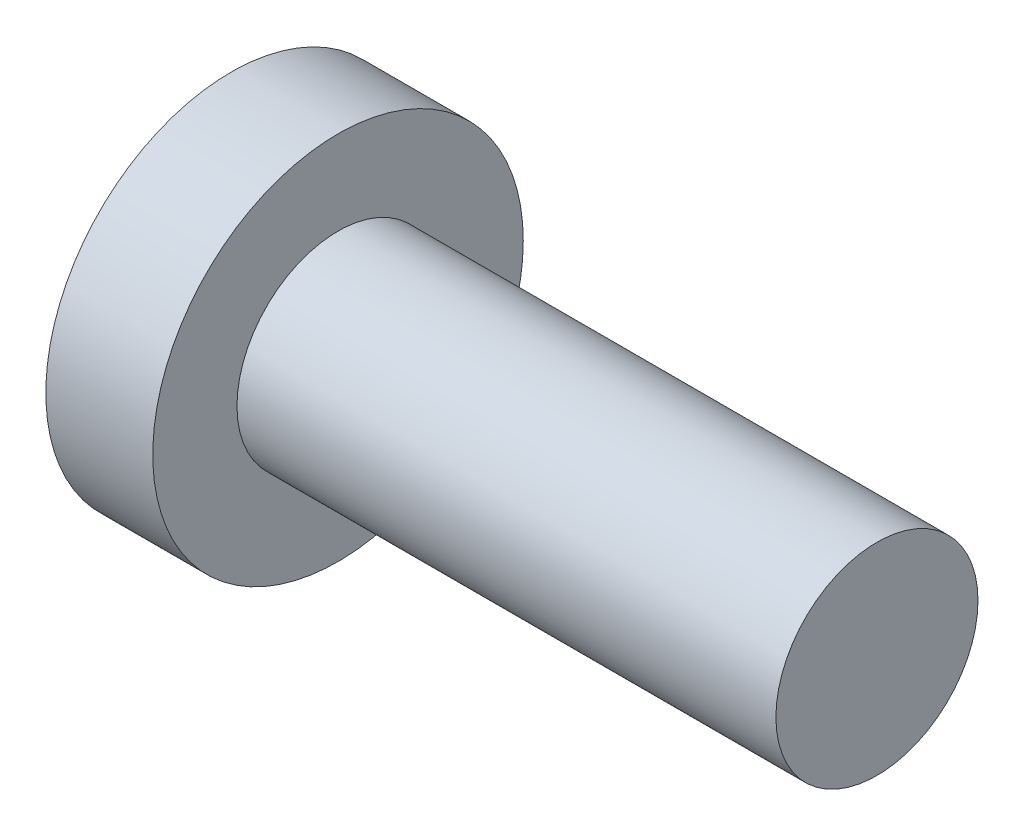
ISO-10303-21;
HEADER;
FILE_DESCRIPTION(('STEP AP214'),'2;1');
FILE_NAME('part.step','',(''),(''),'','','');
FILE_SCHEMA(('AUTOMOTIVE_DESIGN { 1 0 10303 214 1 1 1 1 }'));
ENDSEC;
DATA;
#1=APPLICATION_CONTEXT('core data for automotive mechanical design processes');
#2=APPLICATION_PROTOCOL_DEFINITION('international standard','automotive_design',2000,#1);
#3=PRODUCT_CONTEXT('',#1,'mechanical');
#4=PRODUCT('Part','Part','',(#3));
#5=PRODUCT_RELATED_PRODUCT_CATEGORY('part','',(#4));
#6=PRODUCT_DEFINITION_FORMATION('','',#4);
#7=PRODUCT_DEFINITION_CONTEXT('part definition',#1,'design');
#8=PRODUCT_DEFINITION('design','',#6,#7);
#9=PRODUCT_DEFINITION_SHAPE('','',#8);
#10=(LENGTH_UNIT() NAMED_UNIT(*) SI_UNIT(.MILLI.,.METRE.));
#11=(NAMED_UNIT(*) PLANE_ANGLE_UNIT() SI_UNIT($,.RADIAN.));
#12=(NAMED_UNIT(*) SI_UNIT($,.STERADIAN.) SOLID_ANGLE_UNIT());
#13=UNCERTAINTY_MEASURE_WITH_UNIT(LENGTH_MEASURE(1.E-05),#10,'distance_accuracy_value','');
#14=(GEOMETRIC_REPRESENTATION_CONTEXT(3) GLOBAL_UNCERTAINTY_ASSIGNED_CONTEXT((#13)) GLOBAL_UNIT_ASSIGNED_CONTEXT((#10,
#11,#12)) REPRESENTATION_CONTEXT('',''));
#15=CARTESIAN_POINT('',(0.,0.,0.));
#16=DIRECTION('',(0.,0.,1.));
#17=DIRECTION('',(1.,0.,0.));
#18=AXIS2_PLACEMENT_3D('',#15,#16,#17);
#19=CARTESIAN_POINT('',(1.43,0.65,0.65));
#20=DIRECTION('',(-1.,0.,0.));
#21=DIRECTION('',(0.,0.,1.));
#22=AXIS2_PLACEMENT_3D('',#19,#20,#21);
#23=CYLINDRICAL_SURFACE('',#22,0.3);
#24=CARTESIAN_POINT('',(0.0390374228846766,0.35,0.65));
#25=CARTESIAN_POINT('',(0.0374700696638658,0.34998544067643,0.633229437888941));
#26=CARTESIAN_POINT('',(0.0360362295177234,0.351405486089793,0.616448539980974));
#27=CARTESIAN_POINT('',(0.0334709448814629,0.357021751304628,0.583343330580105));
#28=CARTESIAN_POINT('',(0.0323393355275842,0.361216453200111,0.567018774526812));
#29=CARTESIAN_POINT('',(0.0304114468963169,0.372292892401518,0.535273513398965));
#30=CARTESIAN_POINT('',(0.029615392910895,0.379176429036378,0.51985342154276));
#31=CARTESIAN_POINT('',(0.028382882185795,0.395434490351744,0.490377163085997));
#32=CARTESIAN_POINT('',(0.0279463294243937,0.404808348989252,0.476320633167531));
#33=CARTESIAN_POINT('',(0.0274466900455165,0.425734989748978,0.450034550612778));
#34=CARTESIAN_POINT('',(0.027381890490309,0.437277524530174,0.437796871877239));
#35=CARTESIAN_POINT('',(0.0276230804517179,0.462240773171526,0.415420847670324));
#36=CARTESIAN_POINT('',(0.0279290630327812,0.475661451896475,0.405282462935393));
#37=CARTESIAN_POINT('',(0.0289017433450777,0.503968426614401,0.387407980875408));
#38=CARTESIAN_POINT('',(0.029567770245299,0.51885195497791,0.37966745793607));
#39=CARTESIAN_POINT('',(0.0312408202308291,0.549680910359767,0.36677769759899));
#40=CARTESIAN_POINT('',(0.0322476894543493,0.565625855632694,0.361627293582226));
#41=CARTESIAN_POINT('',(0.0342092443095832,0.593044488577363,0.355232268259739));
#42=CARTESIAN_POINT('',(0.0350823322341695,0.604362334834789,0.353270564588359));
#43=CARTESIAN_POINT('',(0.0369623532932969,0.627120664358063,0.350654423175288));
#44=CARTESIAN_POINT('',(0.0379690934132483,0.638560949301742,0.349998121672442));
#45=CARTESIAN_POINT('',(0.0390374228846759,0.65,0.35));
#46=B_SPLINE_CURVE_WITH_KNOTS('',3,(#24,#25,#26,#27,#28,#29,#30,#31,#32,#33,#34,#35,#36,#37,#38,
#39,#40,#41,#42,#43,#44,#45),.UNSPECIFIED.,.F.,.F.,(4,2,2,2,2,2,2,2,2,2,4),(0.,
0.0504676736393197,0.10090776119767,0.151381660510975,0.201842074017076,0.252069791742457,
0.302296569962963,0.352430087076273,0.402541003213729,0.43702894693274,0.471467615752191),.UNSPECIFIED.);
#47=CARTESIAN_POINT('',(0.0390374228846765,0.35,0.65));
#48=VERTEX_POINT('',#47);
#49=CARTESIAN_POINT('',(0.0390374228846762,0.65,0.35));
#50=VERTEX_POINT('',#49);
#51=EDGE_CURVE('E22',#48,#50,#46,.T.);
#52=ORIENTED_EDGE('',*,*,#51,.T.);
#53=DIRECTION('',(1.,0.,0.));
#54=VECTOR('',#53,1.);
#55=CARTESIAN_POINT('',(1.43,0.65,0.35));
#56=LINE('',#55,#54);
#57=CARTESIAN_POINT('',(1.43,0.65,0.35));
#58=VERTEX_POINT('',#57);
#59=EDGE_CURVE('E126',#58,#50,#56,.F.);
#60=ORIENTED_EDGE('',*,*,#59,.F.);
#61=CARTESIAN_POINT('',(1.43,0.65,0.65));
#62=DIRECTION('',(-1.,0.,0.));
#63=DIRECTION('',(0.,0.,1.));
#64=AXIS2_PLACEMENT_3D('',#61,#62,#63);
#65=CIRCLE('',#64,0.3);
#66=CARTESIAN_POINT('',(1.43,0.35,0.65));
#67=VERTEX_POINT('',#66);
#68=EDGE_CURVE('E159',#58,#67,#65,.T.);
#69=ORIENTED_EDGE('',*,*,#68,.T.);
#70=DIRECTION('',(1.,0.,0.));
#71=VECTOR('',#70,1.);
#72=CARTESIAN_POINT('',(1.43,0.35,0.65));
#73=LINE('',#72,#71);
#74=EDGE_CURVE('E129',#48,#67,#73,.T.);
#75=ORIENTED_EDGE('',*,*,#74,.F.);
#76=EDGE_LOOP('',(#52,#60,#69,#75));
#77=FACE_BOUND('',#76,.T.);
#78=ADVANCED_FACE('F18',(#77),#23,.T.);
#79=CARTESIAN_POINT('',(0.,0.,1.75));
#80=DIRECTION('',(-0.500000000000001,0.,-0.866025403784438));
#81=DIRECTION('',(-0.866025403784438,0.,0.500000000000001));
#82=AXIS2_PLACEMENT_3D('',#79,#80,#81);
#83=PLANE('',#82);
#84=DIRECTION('',(0.866025403784438,0.,-0.500000000000001));
#85=VECTOR('',#84,1.);
#86=CARTESIAN_POINT('',(0.202207901971564,-0.35,1.63325521336445));
#87=LINE('',#86,#85);
#88=CARTESIAN_POINT('',(0.202207901971563,-0.350000000000001,1.63325521336445));
#89=VERTEX_POINT('',#88);
#90=CARTESIAN_POINT('',(1.43,-0.35,0.924389115058833));
#91=VERTEX_POINT('',#90);
#92=EDGE_CURVE('E245',#89,#91,#87,.T.);
#93=ORIENTED_EDGE('',*,*,#92,.F.);
#94=CARTESIAN_POINT('',(0.202207901971563,-0.350000000000001,1.63325521336445));
#95=CARTESIAN_POINT('',(0.196936380277208,-0.233333333333334,1.63629872783372));
#96=CARTESIAN_POINT('',(0.19430061943003,-0.116666666666668,1.63782048506836));
#97=CARTESIAN_POINT('',(0.19430061943003,0.116666666666666,1.63782048506836));
#98=CARTESIAN_POINT('',(0.196936380277208,0.233333333333333,1.63629872783372));
#99=CARTESIAN_POINT('',(0.202207901971563,0.35,1.63325521336445));
#100=B_SPLINE_CURVE_WITH_KNOTS('',3,(#94,#95,#96,#97,#98,#99),.UNSPECIFIED.,.F.,.F.,(4,2,4),(0.,
0.35011907520574,0.700238150411479),.UNSPECIFIED.);
#101=CARTESIAN_POINT('',(0.202207901971563,0.349999999999999,1.63325521336445));
#102=VERTEX_POINT('',#101);
#103=EDGE_CURVE('E131',#89,#102,#100,.T.);
#104=ORIENTED_EDGE('',*,*,#103,.T.);
#105=DIRECTION('',(-0.866025403784438,0.,0.500000000000001));
#106=VECTOR('',#105,1.);
#107=CARTESIAN_POINT('',(1.43,0.35,0.924389115058833));
#108=LINE('',#107,#106);
#109=CARTESIAN_POINT('',(1.43,0.35,0.924389115058833));
#110=VERTEX_POINT('',#109);
#111=EDGE_CURVE('E242',#110,#102,#108,.T.);
#112=ORIENTED_EDGE('',*,*,#111,.F.);
#113=DIRECTION('',(0.,1.,0.));
#114=VECTOR('',#113,1.);
#115=CARTESIAN_POINT('',(1.43,0.35,0.924389115058833));
#116=LINE('',#115,#114);
#117=EDGE_CURVE('E191',#110,#91,#116,.F.);
#118=ORIENTED_EDGE('',*,*,#117,.T.);
#119=EDGE_LOOP('',(#93,#104,#112,#118));
#120=FACE_BOUND('',#119,.T.);
#121=ADVANCED_FACE('F225',(#120),#83,.T.);
#122=CARTESIAN_POINT('',(1.43,-0.65,0.65));
#123=DIRECTION('',(-1.,0.,0.));
#124=DIRECTION('',(0.,0.,1.));
#125=AXIS2_PLACEMENT_3D('',#122,#123,#124);
#126=CYLINDRICAL_SURFACE('',#125,0.3);
#127=CARTESIAN_POINT('',(0.0390374228846759,-0.65,0.35));
#128=CARTESIAN_POINT('',(0.0374700696638644,-0.633229437888941,0.349985440676429));
#129=CARTESIAN_POINT('',(0.0360362295177222,-0.616448539980973,0.351405486089793));
#130=CARTESIAN_POINT('',(0.0334709448814625,-0.583343330580105,0.357021751304628));
#131=CARTESIAN_POINT('',(0.0323393355275844,-0.567018774526812,0.361216453200112));
#132=CARTESIAN_POINT('',(0.0304114468963172,-0.535273513398965,0.372292892401519));
#133=CARTESIAN_POINT('',(0.0296153929108947,-0.519853421542759,0.379176429036379));
#134=CARTESIAN_POINT('',(0.0283828821857953,-0.490377163085996,0.395434490351744));
#135=CARTESIAN_POINT('',(0.027946329424395,-0.47632063316753,0.404808348989253));
#136=CARTESIAN_POINT('',(0.0274466900455177,-0.450034550612777,0.425734989748979));
#137=CARTESIAN_POINT('',(0.0273818904903091,-0.437796871877238,0.437277524530176));
#138=CARTESIAN_POINT('',(0.0276230804517179,-0.415420847670323,0.462240773171527));
#139=CARTESIAN_POINT('',(0.0279290630327823,-0.405282462935391,0.475661451896476));
#140=CARTESIAN_POINT('',(0.0289017433450779,-0.387407980875407,0.503968426614401));
#141=CARTESIAN_POINT('',(0.0295677702452972,-0.379667457936069,0.518851954977912));
#142=CARTESIAN_POINT('',(0.0312408202308276,-0.36677769759899,0.549680910359769));
#143=CARTESIAN_POINT('',(0.03224768945435,-0.361627293582226,0.565625855632695));
#144=CARTESIAN_POINT('',(0.0342092443095843,-0.355232268259739,0.593044488577364));
#145=CARTESIAN_POINT('',(0.0350823322341699,-0.353270564588359,0.60436233483479));
#146=CARTESIAN_POINT('',(0.0369623532932964,-0.350654423175288,0.627120664358064));
#147=CARTESIAN_POINT('',(0.0379690934132477,-0.349998121672441,0.638560949301742));
#148=CARTESIAN_POINT('',(0.0390374228846766,-0.349999999999999,0.65));
#149=B_SPLINE_CURVE_WITH_KNOTS('',3,(#127,#128,#129,#130,#131,#132,#133,#134,#135,#136,#137,
#138,#139,#140,#141,#142,#143,#144,#145,#146,#147,#148),.UNSPECIFIED.,.F.,.F.,(4,2,2,2,2,2,2,2,
2,2,4),(0.,0.05046767363932,0.100907761197671,0.151381660510976,0.201842074017078,
0.252069791742458,0.302296569962965,0.352430087076275,0.40254100321373,0.437028946932741,
0.471467615752192),.UNSPECIFIED.);
#150=CARTESIAN_POINT('',(0.0390374228846762,-0.65,0.35));
#151=VERTEX_POINT('',#150);
#152=CARTESIAN_POINT('',(0.0390374228846765,-0.35,0.65));
#153=VERTEX_POINT('',#152);
#154=EDGE_CURVE('E228',#151,#153,#149,.T.);
#155=ORIENTED_EDGE('',*,*,#154,.T.);
#156=DIRECTION('',(1.,0.,0.));
#157=VECTOR('',#156,1.);
#158=CARTESIAN_POINT('',(1.43,-0.35,0.65));
#159=LINE('',#158,#157);
#160=CARTESIAN_POINT('',(1.43,-0.35,0.65));
#161=VERTEX_POINT('',#160);
#162=EDGE_CURVE('E254',#161,#153,#159,.F.);
#163=ORIENTED_EDGE('',*,*,#162,.F.);
#164=CARTESIAN_POINT('',(1.43,-0.65,0.65));
#165=DIRECTION('',(-1.,0.,0.));
#166=DIRECTION('',(0.,0.,1.));
#167=AXIS2_PLACEMENT_3D('',#164,#165,#166);
#168=CIRCLE('',#167,0.3);
#169=CARTESIAN_POINT('',(1.43,-0.65,0.35));
#170=VERTEX_POINT('',#169);
#171=EDGE_CURVE('E193',#161,#170,#168,.T.);
#172=ORIENTED_EDGE('',*,*,#171,.T.);
#173=DIRECTION('',(1.,0.,0.));
#174=VECTOR('',#173,1.);
#175=CARTESIAN_POINT('',(1.43,-0.65,0.35));
#176=LINE('',#175,#174);
#177=EDGE_CURVE('E310',#151,#170,#176,.T.);
#178=ORIENTED_EDGE('',*,*,#177,.F.);
#179=EDGE_LOOP('',(#155,#163,#172,#178));
#180=FACE_BOUND('',#179,.T.);
#181=ADVANCED_FACE('F221',(#180),#126,.T.);
#182=CARTESIAN_POINT('',(0.,-1.75,0.));
#183=DIRECTION('',(-0.500000000000001,0.866025403784438,0.));
#184=DIRECTION('',(-0.866025403784438,-0.500000000000001,0.));
#185=AXIS2_PLACEMENT_3D('',#182,#183,#184);
#186=PLANE('',#185);
#187=DIRECTION('',(0.866025403784438,0.500000000000001,0.));
#188=VECTOR('',#187,1.);
#189=CARTESIAN_POINT('',(0.202207901971564,-1.63325521336445,-0.35));
#190=LINE('',#189,#188);
#191=CARTESIAN_POINT('',(0.202207901971563,-1.63325521336445,-0.35));
#192=VERTEX_POINT('',#191);
#193=CARTESIAN_POINT('',(1.43,-0.924389115058833,-0.35));
#194=VERTEX_POINT('',#193);
#195=EDGE_CURVE('E396',#192,#194,#190,.T.);
#196=ORIENTED_EDGE('',*,*,#195,.F.);
#197=CARTESIAN_POINT('',(0.202207901971563,-1.63325521336445,-0.35));
#198=CARTESIAN_POINT('',(0.196936380277208,-1.63629872783372,-0.233333333333334));
#199=CARTESIAN_POINT('',(0.194300619430031,-1.63782048506836,-0.116666666666667));
#200=CARTESIAN_POINT('',(0.194300619430032,-1.63782048506836,0.116666666666667));
#201=CARTESIAN_POINT('',(0.19693638027721,-1.63629872783373,0.233333333333333));
#202=CARTESIAN_POINT('',(0.202207901971566,-1.63325521336446,0.35));
#203=B_SPLINE_CURVE_WITH_KNOTS('',3,(#197,#198,#199,#200,#201,#202),.UNSPECIFIED.,.F.,.F.,(4,2,
4),(0.,0.35011907520574,0.700238150411479),.UNSPECIFIED.);
#204=CARTESIAN_POINT('',(0.202207901971563,-1.63325521336445,0.349999999999999));
#205=VERTEX_POINT('',#204);
#206=EDGE_CURVE('E206',#192,#205,#203,.T.);
#207=ORIENTED_EDGE('',*,*,#206,.T.);
#208=DIRECTION('',(-0.866025403784438,-0.500000000000001,0.));
#209=VECTOR('',#208,1.);
#210=CARTESIAN_POINT('',(1.43,-0.924389115058834,0.35));
#211=LINE('',#210,#209);
#212=CARTESIAN_POINT('',(1.43,-0.924389115058834,0.35));
#213=VERTEX_POINT('',#212);
#214=EDGE_CURVE('E299',#213,#205,#211,.T.);
#215=ORIENTED_EDGE('',*,*,#214,.F.);
#216=DIRECTION('',(0.,0.,-1.));
#217=VECTOR('',#216,1.);
#218=CARTESIAN_POINT('',(1.43,-0.924389115058834,0.35));
#219=LINE('',#218,#217);
#220=EDGE_CURVE('E302',#213,#194,#219,.T.);
#221=ORIENTED_EDGE('',*,*,#220,.T.);
#222=EDGE_LOOP('',(#196,#207,#215,#221));
#223=FACE_BOUND('',#222,.T.);
#224=ADVANCED_FACE('F216',(#223),#186,.T.);
#225=CARTESIAN_POINT('',(1.43,-0.65,-0.65));
#226=DIRECTION('',(-1.,0.,0.));
#227=DIRECTION('',(0.,0.,1.));
#228=AXIS2_PLACEMENT_3D('',#225,#226,#227);
#229=CYLINDRICAL_SURFACE('',#228,0.3);
#230=CARTESIAN_POINT('',(0.0390374228846766,-0.349999999999999,-0.650000000000004));
#231=CARTESIAN_POINT('',(0.0374700696638669,-0.34998544067643,-0.633229437888945));
#232=CARTESIAN_POINT('',(0.0360362295177245,-0.351405486089793,-0.616448539980978));
#233=CARTESIAN_POINT('',(0.0334709448814636,-0.357021751304627,-0.583343330580109));
#234=CARTESIAN_POINT('',(0.0323393355275844,-0.36121645320011,-0.567018774526816));
#235=CARTESIAN_POINT('',(0.0304114468963167,-0.372292892401516,-0.535273513398969));
#236=CARTESIAN_POINT('',(0.0296153929108949,-0.379176429036376,-0.519853421542763));
#237=CARTESIAN_POINT('',(0.0283828821857951,-0.395434490351743,-0.490377163086001));
#238=CARTESIAN_POINT('',(0.0279463294243938,-0.404808348989251,-0.476320633167535));
#239=CARTESIAN_POINT('',(0.0274466900455164,-0.425734989748976,-0.450034550612781));
#240=CARTESIAN_POINT('',(0.0273818904903087,-0.437277524530171,-0.437796871877242));
#241=CARTESIAN_POINT('',(0.0276230804517176,-0.462240773171523,-0.415420847670328));
#242=CARTESIAN_POINT('',(0.0279290630327812,-0.475661451896473,-0.405282462935398));
#243=CARTESIAN_POINT('',(0.0289017433450777,-0.503968426614399,-0.387407980875414));
#244=CARTESIAN_POINT('',(0.0295677702452989,-0.518851954977908,-0.379667457936073));
#245=CARTESIAN_POINT('',(0.031240820230829,-0.549680910359764,-0.36677769759899));
#246=CARTESIAN_POINT('',(0.0322476894543492,-0.565625855632691,-0.361627293582226));
#247=CARTESIAN_POINT('',(0.0342092443095832,-0.59304448857736,-0.355232268259738));
#248=CARTESIAN_POINT('',(0.0350823322341696,-0.604362334834787,-0.353270564588359));
#249=CARTESIAN_POINT('',(0.036962353293297,-0.627120664358062,-0.350654423175288));
#250=CARTESIAN_POINT('',(0.0379690934132484,-0.638560949301742,-0.349998121672442));
#251=CARTESIAN_POINT('',(0.0390374228846759,-0.65,-0.349999999999998));
#252=B_SPLINE_CURVE_WITH_KNOTS('',3,(#230,#231,#232,#233,#234,#235,#236,#237,#238,#239,#240,
#241,#242,#243,#244,#245,#246,#247,#248,#249,#250,#251),.UNSPECIFIED.,.F.,.F.,(4,2,2,2,2,2,2,2,
2,2,4),(0.,0.0504676736393199,0.100907761197671,0.151381660510976,0.201842074017078,
0.252069791742456,0.302296569962963,0.352430087076274,0.40254100321373,0.437028946932742,
0.471467615752195),.UNSPECIFIED.);
#253=CARTESIAN_POINT('',(0.0390374228846765,-0.35,-0.650000000000002));
#254=VERTEX_POINT('',#253);
#255=CARTESIAN_POINT('',(0.0390374228846762,-0.65,-0.35));
#256=VERTEX_POINT('',#255);
#257=EDGE_CURVE('E200',#254,#256,#252,.T.);
#258=ORIENTED_EDGE('',*,*,#257,.T.);
#259=DIRECTION('',(1.,0.,0.));
#260=VECTOR('',#259,1.);
#261=CARTESIAN_POINT('',(1.43,-0.65,-0.35));
#262=LINE('',#261,#260);
#263=CARTESIAN_POINT('',(1.43,-0.65,-0.35));
#264=VERTEX_POINT('',#263);
#265=EDGE_CURVE('E298',#264,#256,#262,.F.);
#266=ORIENTED_EDGE('',*,*,#265,.F.);
#267=CARTESIAN_POINT('',(1.43,-0.65,-0.65));
#268=DIRECTION('',(-1.,0.,0.));
#269=DIRECTION('',(0.,0.,1.));
#270=AXIS2_PLACEMENT_3D('',#267,#268,#269);
#271=CIRCLE('',#270,0.3);
#272=CARTESIAN_POINT('',(1.43,-0.35,-0.65));
#273=VERTEX_POINT('',#272);
#274=EDGE_CURVE('E286',#264,#273,#271,.T.);
#275=ORIENTED_EDGE('',*,*,#274,.T.);
#276=DIRECTION('',(1.,0.,0.));
#277=VECTOR('',#276,1.);
#278=CARTESIAN_POINT('',(1.43,-0.35,-0.65));
#279=LINE('',#278,#277);
#280=EDGE_CURVE('E292',#254,#273,#279,.T.);
#281=ORIENTED_EDGE('',*,*,#280,.F.);
#282=EDGE_LOOP('',(#258,#266,#275,#281));
#283=FACE_BOUND('',#282,.T.);
#284=ADVANCED_FACE('F213',(#283),#229,.T.);
#285=CARTESIAN_POINT('',(0.,0.,-1.75));
#286=DIRECTION('',(-0.500000000000001,0.,0.866025403784438));
#287=DIRECTION('',(0.866025403784438,0.,0.500000000000001));
#288=AXIS2_PLACEMENT_3D('',#285,#286,#287);
#289=PLANE('',#288);
#290=DIRECTION('',(0.866025403784438,0.,0.500000000000001));
#291=VECTOR('',#290,1.);
#292=CARTESIAN_POINT('',(0.202207901971564,0.35,-1.63325521336445));
#293=LINE('',#292,#291);
#294=CARTESIAN_POINT('',(0.202207901971562,0.35,-1.63325521336445));
#295=VERTEX_POINT('',#294);
#296=CARTESIAN_POINT('',(1.43,0.35,-0.924389115058833));
#297=VERTEX_POINT('',#296);
#298=EDGE_CURVE('E409',#295,#297,#293,.T.);
#299=ORIENTED_EDGE('',*,*,#298,.F.);
#300=CARTESIAN_POINT('',(0.202207901971562,0.35,-1.63325521336444));
#301=CARTESIAN_POINT('',(0.196936380277208,0.233333333333333,-1.63629872783372));
#302=CARTESIAN_POINT('',(0.19430061943003,0.116666666666667,-1.63782048506836));
#303=CARTESIAN_POINT('',(0.19430061943003,-0.116666666666667,-1.63782048506836));
#304=CARTESIAN_POINT('',(0.196936380277207,-0.233333333333333,-1.63629872783372));
#305=CARTESIAN_POINT('',(0.202207901971561,-0.35,-1.63325521336444));
#306=B_SPLINE_CURVE_WITH_KNOTS('',3,(#300,#301,#302,#303,#304,#305),.UNSPECIFIED.,.F.,.F.,(4,2,
4),(0.,0.350119075205739,0.700238150411478),.UNSPECIFIED.);
#307=CARTESIAN_POINT('',(0.202207901971562,-0.35,-1.63325521336445));
#308=VERTEX_POINT('',#307);
#309=EDGE_CURVE('E192',#295,#308,#306,.T.);
#310=ORIENTED_EDGE('',*,*,#309,.T.);
#311=DIRECTION('',(-0.866025403784438,0.,-0.500000000000001));
#312=VECTOR('',#311,1.);
#313=CARTESIAN_POINT('',(1.43,-0.35,-0.924389115058833));
#314=LINE('',#313,#312);
#315=CARTESIAN_POINT('',(1.43,-0.35,-0.924389115058833));
#316=VERTEX_POINT('',#315);
#317=EDGE_CURVE('E279',#316,#308,#314,.T.);
#318=ORIENTED_EDGE('',*,*,#317,.F.);
#319=DIRECTION('',(0.,1.,0.));
#320=VECTOR('',#319,1.);
#321=CARTESIAN_POINT('',(1.43,0.35,-0.924389115058833));
#322=LINE('',#321,#320);
#323=EDGE_CURVE('E282',#316,#297,#322,.T.);
#324=ORIENTED_EDGE('',*,*,#323,.T.);
#325=EDGE_LOOP('',(#299,#310,#318,#324));
#326=FACE_BOUND('',#325,.T.);
#327=ADVANCED_FACE('F179',(#326),#289,.T.);
#328=CARTESIAN_POINT('',(1.43,0.65,-0.65));
#329=DIRECTION('',(-1.,0.,0.));
#330=DIRECTION('',(0.,0.,1.));
#331=AXIS2_PLACEMENT_3D('',#328,#329,#330);
#332=CYLINDRICAL_SURFACE('',#331,0.3);
#333=CARTESIAN_POINT('',(0.0390374228846759,0.65,-0.349999999999999));
#334=CARTESIAN_POINT('',(0.0374700696638639,0.63322943788894,-0.349985440676428));
#335=CARTESIAN_POINT('',(0.0360362295177218,0.616448539980973,-0.351405486089793));
#336=CARTESIAN_POINT('',(0.0334709448814624,0.583343330580104,-0.35702175130463));
#337=CARTESIAN_POINT('',(0.0323393355275846,0.567018774526811,-0.361216453200114));
#338=CARTESIAN_POINT('',(0.030411446896317,0.535273513398963,-0.372292892401521));
#339=CARTESIAN_POINT('',(0.0296153929108941,0.519853421542758,-0.37917642903638));
#340=CARTESIAN_POINT('',(0.0283828821857942,0.490377163085994,-0.395434490351745));
#341=CARTESIAN_POINT('',(0.0279463294243939,0.476320633167528,-0.404808348989254));
#342=CARTESIAN_POINT('',(0.0274466900455171,0.450034550612775,-0.42573498974898));
#343=CARTESIAN_POINT('',(0.0273818904903088,0.437796871877236,-0.437277524530176));
#344=CARTESIAN_POINT('',(0.0276230804517179,0.415420847670323,-0.46224077317153));
#345=CARTESIAN_POINT('',(0.0279290630327822,0.405282462935393,-0.47566145189648));
#346=CARTESIAN_POINT('',(0.028901743345078,0.387407980875408,-0.503968426614406));
#347=CARTESIAN_POINT('',(0.0295677702452976,0.379667457936067,-0.518851954977916));
#348=CARTESIAN_POINT('',(0.0312408202308284,0.366777697598988,-0.549680910359773));
#349=CARTESIAN_POINT('',(0.032247689454351,0.361627293582228,-0.565625855632701));
#350=CARTESIAN_POINT('',(0.0342092443095849,0.35523226825974,-0.59304448857737));
#351=CARTESIAN_POINT('',(0.0350823322341701,0.353270564588359,-0.604362334834796));
#352=CARTESIAN_POINT('',(0.0369623532932961,0.350654423175286,-0.627120664358069));
#353=CARTESIAN_POINT('',(0.0379690934132473,0.349998121672439,-0.638560949301747));
#354=CARTESIAN_POINT('',(0.0390374228846766,0.349999999999999,-0.650000000000004));
#355=B_SPLINE_CURVE_WITH_KNOTS('',3,(#333,#334,#335,#336,#337,#338,#339,#340,#341,#342,#343,
#344,#345,#346,#347,#348,#349,#350,#351,#352,#353,#354),.UNSPECIFIED.,.F.,.F.,(4,2,2,2,2,2,2,2,
2,2,4),(0.,0.0504676736393203,0.100907761197672,0.151381660510978,0.20184207401708,
0.25206979174246,0.302296569962967,0.352430087076279,0.402541003213735,0.437028946932745,
0.471467615752195),.UNSPECIFIED.);
#356=CARTESIAN_POINT('',(0.0390374228846762,0.65,-0.35));
#357=VERTEX_POINT('',#356);
#358=CARTESIAN_POINT('',(0.0390374228846765,0.35,-0.650000000000002));
#359=VERTEX_POINT('',#358);
#360=EDGE_CURVE('E184',#357,#359,#355,.T.);
#361=ORIENTED_EDGE('',*,*,#360,.T.);
#362=DIRECTION('',(1.,0.,0.));
#363=VECTOR('',#362,1.);
#364=CARTESIAN_POINT('',(1.43,0.35,-0.65));
#365=LINE('',#364,#363);
#366=CARTESIAN_POINT('',(1.43,0.35,-0.65));
#367=VERTEX_POINT('',#366);
#368=EDGE_CURVE('E278',#367,#359,#365,.F.);
#369=ORIENTED_EDGE('',*,*,#368,.F.);
#370=CARTESIAN_POINT('',(1.43,0.65,-0.65));
#371=DIRECTION('',(-1.,0.,0.));
#372=DIRECTION('',(0.,0.,1.));
#373=AXIS2_PLACEMENT_3D('',#370,#371,#372);
#374=CIRCLE('',#373,0.3);
#375=CARTESIAN_POINT('',(1.43,0.65,-0.35));
#376=VERTEX_POINT('',#375);
#377=EDGE_CURVE('E285',#367,#376,#374,.T.);
#378=ORIENTED_EDGE('',*,*,#377,.T.);
#379=DIRECTION('',(1.,0.,0.));
#380=VECTOR('',#379,1.);
#381=CARTESIAN_POINT('',(1.43,0.65,-0.35));
#382=LINE('',#381,#380);
#383=EDGE_CURVE('E272',#357,#376,#382,.T.);
#384=ORIENTED_EDGE('',*,*,#383,.F.);
#385=EDGE_LOOP('',(#361,#369,#378,#384));
#386=FACE_BOUND('',#385,.T.);
#387=ADVANCED_FACE('F174',(#386),#332,.T.);
#388=CARTESIAN_POINT('',(1.43,0.35,0.35));
#389=DIRECTION('',(1.,0.,0.));
#390=DIRECTION('',(0.,0.,-1.));
#391=AXIS2_PLACEMENT_3D('',#388,#389,#390);
#392=PLANE('',#391);
#393=ORIENTED_EDGE('',*,*,#68,.F.);
#394=DIRECTION('',(0.,1.,0.));
#395=VECTOR('',#394,1.);
#396=CARTESIAN_POINT('',(1.43,0.35,0.35));
#397=LINE('',#396,#395);
#398=CARTESIAN_POINT('',(1.43,0.924389115058834,0.35));
#399=VERTEX_POINT('',#398);
#400=EDGE_CURVE('E138',#399,#58,#397,.F.);
#401=ORIENTED_EDGE('',*,*,#400,.F.);
#402=DIRECTION('',(0.,0.,1.));
#403=VECTOR('',#402,1.);
#404=CARTESIAN_POINT('',(1.43,0.924389115058834,0.));
#405=LINE('',#404,#403);
#406=CARTESIAN_POINT('',(1.43,0.924389115058834,-0.35));
#407=VERTEX_POINT('',#406);
#408=EDGE_CURVE('E150',#407,#399,#405,.T.);
#409=ORIENTED_EDGE('',*,*,#408,.F.);
#410=DIRECTION('',(0.,1.,0.));
#411=VECTOR('',#410,1.);
#412=CARTESIAN_POINT('',(1.43,0.35,-0.35));
#413=LINE('',#412,#411);
#414=EDGE_CURVE('E270',#376,#407,#413,.T.);
#415=ORIENTED_EDGE('',*,*,#414,.F.);
#416=ORIENTED_EDGE('',*,*,#377,.F.);
#417=DIRECTION('',(0.,0.,-1.));
#418=VECTOR('',#417,1.);
#419=CARTESIAN_POINT('',(1.43,0.35,-0.35));
#420=LINE('',#419,#418);
#421=EDGE_CURVE('E275',#297,#367,#420,.F.);
#422=ORIENTED_EDGE('',*,*,#421,.F.);
#423=ORIENTED_EDGE('',*,*,#323,.F.);
#424=DIRECTION('',(0.,0.,1.));
#425=VECTOR('',#424,1.);
#426=CARTESIAN_POINT('',(1.43,-0.35,-0.35));
#427=LINE('',#426,#425);
#428=EDGE_CURVE('E289',#273,#316,#427,.F.);
#429=ORIENTED_EDGE('',*,*,#428,.F.);
#430=ORIENTED_EDGE('',*,*,#274,.F.);
#431=DIRECTION('',(0.,1.,0.));
#432=VECTOR('',#431,1.);
#433=CARTESIAN_POINT('',(1.43,-0.35,-0.35));
#434=LINE('',#433,#432);
#435=EDGE_CURVE('E295',#194,#264,#434,.T.);
#436=ORIENTED_EDGE('',*,*,#435,.F.);
#437=ORIENTED_EDGE('',*,*,#220,.F.);
#438=DIRECTION('',(0.,1.,0.));
#439=VECTOR('',#438,1.);
#440=CARTESIAN_POINT('',(1.43,-0.35,0.35));
#441=LINE('',#440,#439);
#442=EDGE_CURVE('E307',#170,#213,#441,.F.);
#443=ORIENTED_EDGE('',*,*,#442,.F.);
#444=ORIENTED_EDGE('',*,*,#171,.F.);
#445=DIRECTION('',(0.,0.,1.));
#446=VECTOR('',#445,1.);
#447=CARTESIAN_POINT('',(1.43,-0.35,0.35));
#448=LINE('',#447,#446);
#449=EDGE_CURVE('E251',#91,#161,#448,.F.);
#450=ORIENTED_EDGE('',*,*,#449,.F.);
#451=ORIENTED_EDGE('',*,*,#117,.F.);
#452=DIRECTION('',(0.,0.,-1.));
#453=VECTOR('',#452,1.);
#454=CARTESIAN_POINT('',(1.43,0.35,0.35));
#455=LINE('',#454,#453);
#456=EDGE_CURVE('E250',#67,#110,#455,.F.);
#457=ORIENTED_EDGE('',*,*,#456,.F.);
#458=EDGE_LOOP('',(#393,#401,#409,#415,#416,#422,#423,#429,#430,#436,#437,#443,#444,#450,#451,#457));
#459=FACE_BOUND('',#458,.T.);
#460=ADVANCED_FACE('F170',(#459),#392,.F.);
#461=CARTESIAN_POINT('',(1.43,0.35,0.35));
#462=DIRECTION('',(0.,0.,-1.));
#463=DIRECTION('',(0.,1.,0.));
#464=AXIS2_PLACEMENT_3D('',#461,#462,#463);
#465=PLANE('',#464);
#466=CARTESIAN_POINT('',(0.202207901971563,1.63325521336445,0.35));
#467=CARTESIAN_POINT('',(0.163316516688185,1.47132033775017,0.35));
#468=CARTESIAN_POINT('',(0.130273284122589,1.308414965496,0.35));
#469=CARTESIAN_POINT('',(0.07588312442696,0.980663227707849,0.35));
#470=CARTESIAN_POINT('',(0.0545361972969271,0.815816862173875,0.349999999999999));
#471=CARTESIAN_POINT('',(0.0390374228846759,0.650000000000001,0.349999999999999));
#472=B_SPLINE_CURVE_WITH_KNOTS('',3,(#466,#467,#468,#469,#470,#471),.UNSPECIFIED.,.F.,.F.,(4,2,
4),(0.,0.498668366501124,0.997336733002248),.UNSPECIFIED.);
#473=CARTESIAN_POINT('',(0.202207901971563,1.63325521336445,0.35));
#474=VERTEX_POINT('',#473);
#475=EDGE_CURVE('E136',#474,#50,#472,.T.);
#476=ORIENTED_EDGE('',*,*,#475,.F.);
#477=DIRECTION('',(0.866025403784438,-0.500000000000001,0.));
#478=VECTOR('',#477,1.);
#479=CARTESIAN_POINT('',(0.,1.75,0.35));
#480=LINE('',#479,#478);
#481=EDGE_CURVE('E146',#399,#474,#480,.F.);
#482=ORIENTED_EDGE('',*,*,#481,.F.);
#483=ORIENTED_EDGE('',*,*,#400,.T.);
#484=ORIENTED_EDGE('',*,*,#59,.T.);
#485=EDGE_LOOP('',(#476,#482,#483,#484));
#486=FACE_BOUND('',#485,.T.);
#487=ADVANCED_FACE('F134',(#486),#465,.T.);
#488=CARTESIAN_POINT('',(1.43,0.35,0.35));
#489=DIRECTION('',(0.,-1.,0.));
#490=DIRECTION('',(0.,0.,-1.));
#491=AXIS2_PLACEMENT_3D('',#488,#489,#490);
#492=PLANE('',#491);
#493=ORIENTED_EDGE('',*,*,#456,.T.);
#494=ORIENTED_EDGE('',*,*,#111,.T.);
#495=CARTESIAN_POINT('',(7.,0.35,0.));
#496=DIRECTION('',(0.,1.,0.));
#497=DIRECTION('',(0.,0.,1.));
#498=AXIS2_PLACEMENT_3D('',#495,#496,#497);
#499=CIRCLE('',#498,6.99124452440336);
#500=EDGE_CURVE('E145',#48,#102,#499,.T.);
#501=ORIENTED_EDGE('',*,*,#500,.F.);
#502=ORIENTED_EDGE('',*,*,#74,.T.);
#503=EDGE_LOOP('',(#493,#494,#501,#502));
#504=FACE_BOUND('',#503,.T.);
#505=ADVANCED_FACE('F169',(#504),#492,.T.);
#506=CARTESIAN_POINT('',(1.43,-0.35,0.35));
#507=DIRECTION('',(0.,1.,0.));
#508=DIRECTION('',(0.,0.,1.));
#509=AXIS2_PLACEMENT_3D('',#506,#507,#508);
#510=PLANE('',#509);
#511=CARTESIAN_POINT('',(7.,-0.35,0.));
#512=DIRECTION('',(0.,1.,0.));
#513=DIRECTION('',(0.,0.,1.));
#514=AXIS2_PLACEMENT_3D('',#511,#512,#513);
#515=CIRCLE('',#514,6.99124452440336);
#516=EDGE_CURVE('E148',#89,#153,#515,.F.);
#517=ORIENTED_EDGE('',*,*,#516,.F.);
#518=ORIENTED_EDGE('',*,*,#92,.T.);
#519=ORIENTED_EDGE('',*,*,#449,.T.);
#520=ORIENTED_EDGE('',*,*,#162,.T.);
#521=EDGE_LOOP('',(#517,#518,#519,#520));
#522=FACE_BOUND('',#521,.T.);
#523=ADVANCED_FACE('F382',(#522),#510,.T.);
#524=CARTESIAN_POINT('',(1.43,-0.35,0.35));
#525=DIRECTION('',(0.,0.,-1.));
#526=DIRECTION('',(0.,1.,0.));
#527=AXIS2_PLACEMENT_3D('',#524,#525,#526);
#528=PLANE('',#527);
#529=ORIENTED_EDGE('',*,*,#442,.T.);
#530=ORIENTED_EDGE('',*,*,#214,.T.);
#531=CARTESIAN_POINT('',(0.0390374228846759,-0.65,0.35));
#532=CARTESIAN_POINT('',(0.0545361972969275,-0.815816862173874,0.35));
#533=CARTESIAN_POINT('',(0.0758831244269607,-0.980663227707848,0.35));
#534=CARTESIAN_POINT('',(0.13027328412259,-1.308414965496,0.349999999999999));
#535=CARTESIAN_POINT('',(0.163316516688186,-1.47132033775017,0.349999999999999));
#536=CARTESIAN_POINT('',(0.202207901971564,-1.63325521336445,0.349999999999998));
#537=B_SPLINE_CURVE_WITH_KNOTS('',3,(#531,#532,#533,#534,#535,#536),.UNSPECIFIED.,.F.,.F.,(4,2,
4),(0.,0.498668366501125,0.997336733002251),.UNSPECIFIED.);
#538=EDGE_CURVE('E373',#151,#205,#537,.T.);
#539=ORIENTED_EDGE('',*,*,#538,.F.);
#540=ORIENTED_EDGE('',*,*,#177,.T.);
#541=EDGE_LOOP('',(#529,#530,#539,#540));
#542=FACE_BOUND('',#541,.T.);
#543=ADVANCED_FACE('F360',(#542),#528,.T.);
#544=CARTESIAN_POINT('',(1.43,-0.35,-0.35));
#545=DIRECTION('',(0.,0.,1.));
#546=DIRECTION('',(1.,0.,0.));
#547=AXIS2_PLACEMENT_3D('',#544,#545,#546);
#548=PLANE('',#547);
#549=CARTESIAN_POINT('',(0.202207901971563,-1.63325521336445,-0.350000000000001));
#550=CARTESIAN_POINT('',(0.163316516688186,-1.47132033775017,-0.350000000000001));
#551=CARTESIAN_POINT('',(0.13027328412259,-1.308414965496,-0.35));
#552=CARTESIAN_POINT('',(0.0758831244269608,-0.980663227707848,-0.35));
#553=CARTESIAN_POINT('',(0.0545361972969277,-0.815816862173875,-0.35));
#554=CARTESIAN_POINT('',(0.0390374228846759,-0.650000000000001,-0.349999999999999));
#555=B_SPLINE_CURVE_WITH_KNOTS('',3,(#549,#550,#551,#552,#553,#554),.UNSPECIFIED.,.F.,.F.,(4,2,
4),(0.,0.498668366501124,0.997336733002248),.UNSPECIFIED.);
#556=EDGE_CURVE('E364',#192,#256,#555,.T.);
#557=ORIENTED_EDGE('',*,*,#556,.F.);
#558=ORIENTED_EDGE('',*,*,#195,.T.);
#559=ORIENTED_EDGE('',*,*,#435,.T.);
#560=ORIENTED_EDGE('',*,*,#265,.T.);
#561=EDGE_LOOP('',(#557,#558,#559,#560));
#562=FACE_BOUND('',#561,.T.);
#563=ADVANCED_FACE('F355',(#562),#548,.T.);
#564=CARTESIAN_POINT('',(1.43,-0.35,-0.35));
#565=DIRECTION('',(0.,1.,0.));
#566=DIRECTION('',(0.,0.,1.));
#567=AXIS2_PLACEMENT_3D('',#564,#565,#566);
#568=PLANE('',#567);
#569=ORIENTED_EDGE('',*,*,#428,.T.);
#570=ORIENTED_EDGE('',*,*,#317,.T.);
#571=CARTESIAN_POINT('',(7.,-0.35,0.));
#572=DIRECTION('',(0.,1.,0.));
#573=DIRECTION('',(0.,0.,1.));
#574=AXIS2_PLACEMENT_3D('',#571,#572,#573);
#575=CIRCLE('',#574,6.99124452440336);
#576=EDGE_CURVE('E372',#254,#308,#575,.F.);
#577=ORIENTED_EDGE('',*,*,#576,.F.);
#578=ORIENTED_EDGE('',*,*,#280,.T.);
#579=EDGE_LOOP('',(#569,#570,#577,#578));
#580=FACE_BOUND('',#579,.T.);
#581=ADVANCED_FACE('F351',(#580),#568,.T.);
#582=CARTESIAN_POINT('',(1.43,0.35,-0.35));
#583=DIRECTION('',(0.,-1.,0.));
#584=DIRECTION('',(0.,0.,-1.));
#585=AXIS2_PLACEMENT_3D('',#582,#583,#584);
#586=PLANE('',#585);
#587=CARTESIAN_POINT('',(7.,0.35,0.));
#588=DIRECTION('',(0.,1.,0.));
#589=DIRECTION('',(0.,0.,1.));
#590=AXIS2_PLACEMENT_3D('',#587,#588,#589);
#591=CIRCLE('',#590,6.99124452440336);
#592=EDGE_CURVE('E446',#295,#359,#591,.T.);
#593=ORIENTED_EDGE('',*,*,#592,.F.);
#594=ORIENTED_EDGE('',*,*,#298,.T.);
#595=ORIENTED_EDGE('',*,*,#421,.T.);
#596=ORIENTED_EDGE('',*,*,#368,.T.);
#597=EDGE_LOOP('',(#593,#594,#595,#596));
#598=FACE_BOUND('',#597,.T.);
#599=ADVANCED_FACE('F348',(#598),#586,.T.);
#600=CARTESIAN_POINT('',(1.43,0.35,-0.35));
#601=DIRECTION('',(0.,0.,1.));
#602=DIRECTION('',(1.,0.,0.));
#603=AXIS2_PLACEMENT_3D('',#600,#601,#602);
#604=PLANE('',#603);
#605=ORIENTED_EDGE('',*,*,#414,.T.);
#606=DIRECTION('',(0.866025403784438,-0.500000000000001,0.));
#607=VECTOR('',#606,1.);
#608=CARTESIAN_POINT('',(0.,1.75,-0.35));
#609=LINE('',#608,#607);
#610=CARTESIAN_POINT('',(0.202207901971563,1.63325521336445,-0.35));
#611=VERTEX_POINT('',#610);
#612=EDGE_CURVE('E42',#611,#407,#609,.T.);
#613=ORIENTED_EDGE('',*,*,#612,.F.);
#614=CARTESIAN_POINT('',(0.0390374228846759,0.65,-0.349999999999999));
#615=CARTESIAN_POINT('',(0.0545361972969271,0.815816862173874,-0.349999999999999));
#616=CARTESIAN_POINT('',(0.07588312442696,0.980663227707848,-0.35));
#617=CARTESIAN_POINT('',(0.130273284122589,1.308414965496,-0.35));
#618=CARTESIAN_POINT('',(0.163316516688185,1.47132033775017,-0.350000000000001));
#619=CARTESIAN_POINT('',(0.202207901971563,1.63325521336445,-0.35));
#620=B_SPLINE_CURVE_WITH_KNOTS('',3,(#614,#615,#616,#617,#618,#619),.UNSPECIFIED.,.F.,.F.,(4,2,
4),(0.,0.498668366501125,0.997336733002251),.UNSPECIFIED.);
#621=EDGE_CURVE('E333',#357,#611,#620,.T.);
#622=ORIENTED_EDGE('',*,*,#621,.F.);
#623=ORIENTED_EDGE('',*,*,#383,.T.);
#624=EDGE_LOOP('',(#605,#613,#622,#623));
#625=FACE_BOUND('',#624,.T.);
#626=ADVANCED_FACE('F343',(#625),#604,.T.);
#627=CARTESIAN_POINT('',(0.,1.75,0.));
#628=DIRECTION('',(-0.500000000000001,-0.866025403784438,0.));
#629=DIRECTION('',(0.866025403784438,-0.500000000000001,0.));
#630=AXIS2_PLACEMENT_3D('',#627,#628,#629);
#631=PLANE('',#630);
#632=ORIENTED_EDGE('',*,*,#481,.T.);
#633=CARTESIAN_POINT('',(0.202207901971563,1.63325521336445,-0.35));
#634=CARTESIAN_POINT('',(0.196936380277209,1.63629872783373,-0.233333333333334));
#635=CARTESIAN_POINT('',(0.194300619430033,1.63782048506837,-0.116666666666667));
#636=CARTESIAN_POINT('',(0.194300619430033,1.63782048506837,0.116666666666667));
#637=CARTESIAN_POINT('',(0.19693638027721,1.63629872783373,0.233333333333334));
#638=CARTESIAN_POINT('',(0.202207901971564,1.63325521336445,0.35));
#639=B_SPLINE_CURVE_WITH_KNOTS('',3,(#633,#634,#635,#636,#637,#638),.UNSPECIFIED.,.F.,.F.,(4,2,
4),(0.,0.35011907520574,0.700238150411479),.UNSPECIFIED.);
#640=EDGE_CURVE('E143',#611,#474,#639,.T.);
#641=ORIENTED_EDGE('',*,*,#640,.F.);
#642=ORIENTED_EDGE('',*,*,#612,.T.);
#643=ORIENTED_EDGE('',*,*,#408,.T.);
#644=EDGE_LOOP('',(#632,#641,#642,#643));
#645=FACE_BOUND('',#644,.T.);
#646=ADVANCED_FACE('F340',(#645),#631,.T.);
#647=CARTESIAN_POINT('',(7.,0.,0.));
#648=DIRECTION('',(0.,1.,0.));
#649=DIRECTION('',(-1.,0.,0.));
#650=AXIS2_PLACEMENT_3D('',#647,#648,#649);
#651=SPHERICAL_SURFACE('',#650,7.);
#652=ORIENTED_EDGE('',*,*,#206,.F.);
#653=ORIENTED_EDGE('',*,*,#556,.T.);
#654=ORIENTED_EDGE('',*,*,#257,.F.);
#655=ORIENTED_EDGE('',*,*,#576,.T.);
#656=ORIENTED_EDGE('',*,*,#309,.F.);
#657=ORIENTED_EDGE('',*,*,#592,.T.);
#658=ORIENTED_EDGE('',*,*,#360,.F.);
#659=ORIENTED_EDGE('',*,*,#621,.T.);
#660=ORIENTED_EDGE('',*,*,#640,.T.);
#661=ORIENTED_EDGE('',*,*,#475,.T.);
#662=ORIENTED_EDGE('',*,*,#51,.F.);
#663=ORIENTED_EDGE('',*,*,#500,.T.);
#664=ORIENTED_EDGE('',*,*,#103,.F.);
#665=ORIENTED_EDGE('',*,*,#516,.T.);
#666=ORIENTED_EDGE('',*,*,#154,.F.);
#667=ORIENTED_EDGE('',*,*,#538,.T.);
#668=EDGE_LOOP('',(#652,#653,#654,#655,#656,#657,#658,#659,#660,#661,#662,#663,#664,#665,#666,#667));
#669=FACE_BOUND('',#668,.T.);
#670=CARTESIAN_POINT('',(0.562803405208132,0.,0.));
#671=DIRECTION('',(1.,0.,0.));
#672=DIRECTION('',(0.,0.,-1.));
#673=AXIS2_PLACEMENT_3D('',#670,#671,#672);
#674=CIRCLE('',#673,2.75);
#675=CARTESIAN_POINT('',(0.562803405208132,0.,-2.75));
#676=VERTEX_POINT('',#675);
#677=EDGE_CURVE('E325',#676,#676,#674,.T.);
#678=ORIENTED_EDGE('',*,*,#677,.F.);
#679=EDGE_LOOP('',(#678));
#680=FACE_BOUND('',#679,.T.);
#681=ADVANCED_FACE('F140',(#669,#680),#651,.T.);
#682=CARTESIAN_POINT('',(4.51581291088132,0.,0.));
#683=DIRECTION('',(1.,0.,0.));
#684=DIRECTION('',(0.,0.,-1.));
#685=AXIS2_PLACEMENT_3D('',#682,#683,#684);
#686=CYLINDRICAL_SURFACE('',#685,2.75);
#687=ORIENTED_EDGE('',*,*,#677,.T.);
#688=EDGE_LOOP('',(#687));
#689=FACE_BOUND('',#688,.T.);
#690=CARTESIAN_POINT('',(2.15,0.,0.));
#691=DIRECTION('',(1.,0.,0.));
#692=DIRECTION('',(0.,0.,-1.));
#693=AXIS2_PLACEMENT_3D('',#690,#691,#692);
#694=CIRCLE('',#693,2.75);
#695=CARTESIAN_POINT('',(2.15,0.,-2.75));
#696=VERTEX_POINT('',#695);
#697=EDGE_CURVE('E322',#696,#696,#694,.T.);
#698=ORIENTED_EDGE('',*,*,#697,.F.);
#699=EDGE_LOOP('',(#698));
#700=FACE_BOUND('',#699,.T.);
#701=ADVANCED_FACE('F471',(#689,#700),#686,.T.);
#702=CARTESIAN_POINT('',(2.15,1.8,0.));
#703=DIRECTION('',(1.,0.,0.));
#704=DIRECTION('',(0.,0.,-1.));
#705=AXIS2_PLACEMENT_3D('',#702,#703,#704);
#706=PLANE('',#705);
#707=CARTESIAN_POINT('',(2.15,0.,0.));
#708=DIRECTION('',(1.,0.,0.));
#709=DIRECTION('',(0.,0.,-1.));
#710=AXIS2_PLACEMENT_3D('',#707,#708,#709);
#711=CIRCLE('',#710,1.5);
#712=CARTESIAN_POINT('',(2.15,0.,-1.5));
#713=VERTEX_POINT('',#712);
#714=EDGE_CURVE('E33',#713,#713,#711,.T.);
#715=ORIENTED_EDGE('',*,*,#714,.F.);
#716=EDGE_LOOP('',(#715));
#717=FACE_BOUND('',#716,.T.);
#718=ORIENTED_EDGE('',*,*,#697,.T.);
#719=EDGE_LOOP('',(#718));
#720=FACE_BOUND('',#719,.T.);
#721=ADVANCED_FACE('F465',(#717,#720),#706,.T.);
#722=CARTESIAN_POINT('',(10.15,1.5,0.));
#723=DIRECTION('',(1.,0.,0.));
#724=DIRECTION('',(0.,0.,-1.));
#725=AXIS2_PLACEMENT_3D('',#722,#723,#724);
#726=PLANE('',#725);
#727=CARTESIAN_POINT('',(10.15,0.,0.));
#728=DIRECTION('',(1.,0.,0.));
#729=DIRECTION('',(0.,0.,-1.));
#730=AXIS2_PLACEMENT_3D('',#727,#728,#729);
#731=CIRCLE('',#730,1.5);
#732=CARTESIAN_POINT('',(10.15,0.,-1.5));
#733=VERTEX_POINT('',#732);
#734=EDGE_CURVE('E11',#733,#733,#731,.F.);
#735=ORIENTED_EDGE('',*,*,#734,.F.);
#736=EDGE_LOOP('',(#735));
#737=FACE_BOUND('',#736,.T.);
#738=ADVANCED_FACE('F459',(#737),#726,.T.);
#739=CARTESIAN_POINT('',(4.51581291088132,0.,0.));
#740=DIRECTION('',(1.,0.,0.));
#741=DIRECTION('',(0.,0.,-1.));
#742=AXIS2_PLACEMENT_3D('',#739,#740,#741);
#743=CYLINDRICAL_SURFACE('',#742,1.5);
#744=ORIENTED_EDGE('',*,*,#734,.T.);
#745=EDGE_LOOP('',(#744));
#746=FACE_BOUND('',#745,.T.);
#747=ORIENTED_EDGE('',*,*,#714,.T.);
#748=EDGE_LOOP('',(#747));
#749=FACE_BOUND('',#748,.T.);
#750=ADVANCED_FACE('F457',(#746,#749),#743,.T.);
#751=CLOSED_SHELL('',(#78,#121,#181,#224,#284,#327,#387,#460,#487,#505,#523,#543,#563,#581,#599,
#626,#646,#681,#701,#721,#738,#750));
#752=MANIFOLD_SOLID_BREP('B1',#751);
#753=ADVANCED_BREP_SHAPE_REPRESENTATION('',(#18,#752),#14);
#754=SHAPE_DEFINITION_REPRESENTATION(#9,#753);
ENDSEC;
END-ISO-10303-21;
